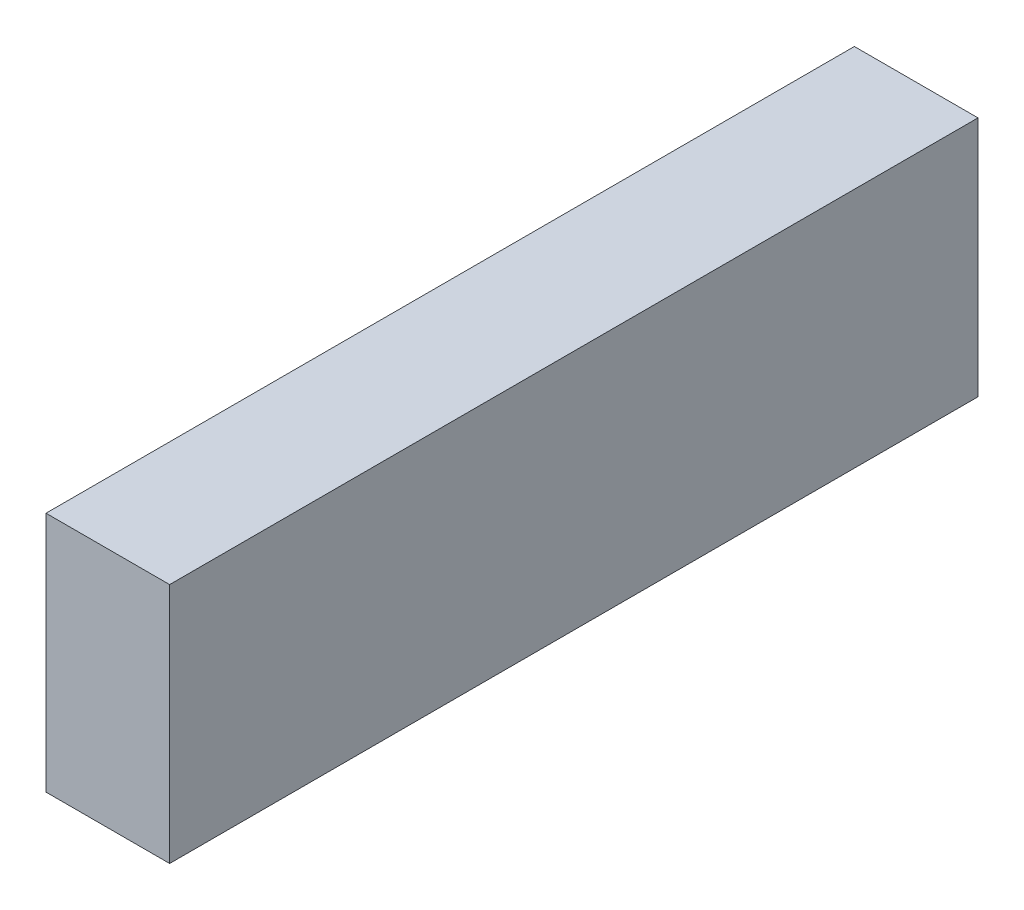
ISO-10303-21;
HEADER;
FILE_DESCRIPTION(('STEP AP214'),'2;1');
FILE_NAME('part.step','',(''),(''),'','','');
FILE_SCHEMA(('AUTOMOTIVE_DESIGN { 1 0 10303 214 1 1 1 1 }'));
ENDSEC;
DATA;
#1=APPLICATION_CONTEXT('core data for automotive mechanical design processes');
#2=APPLICATION_PROTOCOL_DEFINITION('international standard','automotive_design',2000,#1);
#3=PRODUCT_CONTEXT('',#1,'mechanical');
#4=PRODUCT('Part','Part','',(#3));
#5=PRODUCT_RELATED_PRODUCT_CATEGORY('part','',(#4));
#6=PRODUCT_DEFINITION_FORMATION('','',#4);
#7=PRODUCT_DEFINITION_CONTEXT('part definition',#1,'design');
#8=PRODUCT_DEFINITION('design','',#6,#7);
#9=PRODUCT_DEFINITION_SHAPE('','',#8);
#10=(LENGTH_UNIT() NAMED_UNIT(*) SI_UNIT(.MILLI.,.METRE.));
#11=(NAMED_UNIT(*) PLANE_ANGLE_UNIT() SI_UNIT($,.RADIAN.));
#12=(NAMED_UNIT(*) SI_UNIT($,.STERADIAN.) SOLID_ANGLE_UNIT());
#13=UNCERTAINTY_MEASURE_WITH_UNIT(LENGTH_MEASURE(1.E-05),#10,'distance_accuracy_value','');
#14=(GEOMETRIC_REPRESENTATION_CONTEXT(3) GLOBAL_UNCERTAINTY_ASSIGNED_CONTEXT((#13)) GLOBAL_UNIT_ASSIGNED_CONTEXT((#10,
#11,#12)) REPRESENTATION_CONTEXT('',''));
#15=CARTESIAN_POINT('',(0.,0.,0.));
#16=DIRECTION('',(0.,0.,1.));
#17=DIRECTION('',(1.,0.,0.));
#18=AXIS2_PLACEMENT_3D('',#15,#16,#17);
#19=CARTESIAN_POINT('',(0.,0.,8.5));
#20=DIRECTION('',(0.,0.,1.));
#21=DIRECTION('',(1.,0.,0.));
#22=AXIS2_PLACEMENT_3D('',#19,#20,#21);
#23=PLANE('',#22);
#24=DIRECTION('',(0.,1.,0.));
#25=VECTOR('',#24,1.);
#26=CARTESIAN_POINT('',(0.,0.,8.5));
#27=LINE('',#26,#25);
#28=CARTESIAN_POINT('',(0.,0.,8.5));
#29=VERTEX_POINT('',#28);
#30=CARTESIAN_POINT('',(0.,2.54,8.5));
#31=VERTEX_POINT('',#30);
#32=EDGE_CURVE('E112',#29,#31,#27,.T.);
#33=ORIENTED_EDGE('',*,*,#32,.F.);
#34=DIRECTION('',(1.,0.,0.));
#35=VECTOR('',#34,1.);
#36=CARTESIAN_POINT('',(0.,0.,8.5));
#37=LINE('',#36,#35);
#38=CARTESIAN_POINT('',(1.3,0.,8.5));
#39=VERTEX_POINT('',#38);
#40=EDGE_CURVE('E20',#29,#39,#37,.T.);
#41=ORIENTED_EDGE('',*,*,#40,.T.);
#42=DIRECTION('',(0.,1.,0.));
#43=VECTOR('',#42,1.);
#44=CARTESIAN_POINT('',(1.3,0.,8.5));
#45=LINE('',#44,#43);
#46=CARTESIAN_POINT('',(1.3,2.54,8.5));
#47=VERTEX_POINT('',#46);
#48=EDGE_CURVE('E93',#39,#47,#45,.T.);
#49=ORIENTED_EDGE('',*,*,#48,.T.);
#50=DIRECTION('',(1.,0.,0.));
#51=VECTOR('',#50,1.);
#52=CARTESIAN_POINT('',(0.,2.54,8.5));
#53=LINE('',#52,#51);
#54=EDGE_CURVE('E11',#31,#47,#53,.T.);
#55=ORIENTED_EDGE('',*,*,#54,.F.);
#56=EDGE_LOOP('',(#33,#41,#49,#55));
#57=FACE_BOUND('',#56,.T.);
#58=ADVANCED_FACE('F17',(#57),#23,.T.);
#59=CARTESIAN_POINT('',(0.,0.,0.));
#60=DIRECTION('',(0.,0.,1.));
#61=DIRECTION('',(1.,0.,0.));
#62=AXIS2_PLACEMENT_3D('',#59,#60,#61);
#63=PLANE('',#62);
#64=DIRECTION('',(1.,0.,0.));
#65=VECTOR('',#64,1.);
#66=CARTESIAN_POINT('',(0.,2.54,0.));
#67=LINE('',#66,#65);
#68=CARTESIAN_POINT('',(0.,2.54,0.));
#69=VERTEX_POINT('',#68);
#70=CARTESIAN_POINT('',(1.3,2.54,0.));
#71=VERTEX_POINT('',#70);
#72=EDGE_CURVE('E27',#69,#71,#67,.T.);
#73=ORIENTED_EDGE('',*,*,#72,.T.);
#74=DIRECTION('',(0.,1.,0.));
#75=VECTOR('',#74,1.);
#76=CARTESIAN_POINT('',(1.3,0.,0.));
#77=LINE('',#76,#75);
#78=CARTESIAN_POINT('',(1.3,0.,0.));
#79=VERTEX_POINT('',#78);
#80=EDGE_CURVE('E85',#79,#71,#77,.T.);
#81=ORIENTED_EDGE('',*,*,#80,.F.);
#82=DIRECTION('',(1.,0.,0.));
#83=VECTOR('',#82,1.);
#84=CARTESIAN_POINT('',(0.,0.,0.));
#85=LINE('',#84,#83);
#86=CARTESIAN_POINT('',(0.,0.,0.));
#87=VERTEX_POINT('',#86);
#88=EDGE_CURVE('E71',#87,#79,#85,.T.);
#89=ORIENTED_EDGE('',*,*,#88,.F.);
#90=DIRECTION('',(0.,1.,0.));
#91=VECTOR('',#90,1.);
#92=CARTESIAN_POINT('',(0.,0.,0.));
#93=LINE('',#92,#91);
#94=EDGE_CURVE('E96',#87,#69,#93,.T.);
#95=ORIENTED_EDGE('',*,*,#94,.T.);
#96=EDGE_LOOP('',(#73,#81,#89,#95));
#97=FACE_BOUND('',#96,.T.);
#98=ADVANCED_FACE('F83',(#97),#63,.F.);
#99=CARTESIAN_POINT('',(0.,2.54,0.));
#100=DIRECTION('',(0.,1.,0.));
#101=DIRECTION('',(1.,0.,0.));
#102=AXIS2_PLACEMENT_3D('',#99,#100,#101);
#103=PLANE('',#102);
#104=ORIENTED_EDGE('',*,*,#72,.F.);
#105=DIRECTION('',(0.,0.,1.));
#106=VECTOR('',#105,1.);
#107=CARTESIAN_POINT('',(0.,2.54,0.));
#108=LINE('',#107,#106);
#109=EDGE_CURVE('E113',#69,#31,#108,.T.);
#110=ORIENTED_EDGE('',*,*,#109,.T.);
#111=ORIENTED_EDGE('',*,*,#54,.T.);
#112=DIRECTION('',(0.,0.,1.));
#113=VECTOR('',#112,1.);
#114=CARTESIAN_POINT('',(1.3,2.54,0.));
#115=LINE('',#114,#113);
#116=EDGE_CURVE('E87',#71,#47,#115,.T.);
#117=ORIENTED_EDGE('',*,*,#116,.F.);
#118=EDGE_LOOP('',(#104,#110,#111,#117));
#119=FACE_BOUND('',#118,.T.);
#120=ADVANCED_FACE('F130',(#119),#103,.T.);
#121=CARTESIAN_POINT('',(0.,0.,0.));
#122=DIRECTION('',(0.,1.,0.));
#123=DIRECTION('',(1.,0.,0.));
#124=AXIS2_PLACEMENT_3D('',#121,#122,#123);
#125=PLANE('',#124);
#126=DIRECTION('',(0.,0.,1.));
#127=VECTOR('',#126,1.);
#128=CARTESIAN_POINT('',(1.3,0.,0.));
#129=LINE('',#128,#127);
#130=EDGE_CURVE('E74',#79,#39,#129,.T.);
#131=ORIENTED_EDGE('',*,*,#130,.T.);
#132=ORIENTED_EDGE('',*,*,#40,.F.);
#133=DIRECTION('',(0.,0.,1.));
#134=VECTOR('',#133,1.);
#135=CARTESIAN_POINT('',(0.,0.,0.));
#136=LINE('',#135,#134);
#137=EDGE_CURVE('E80',#87,#29,#136,.T.);
#138=ORIENTED_EDGE('',*,*,#137,.F.);
#139=ORIENTED_EDGE('',*,*,#88,.T.);
#140=EDGE_LOOP('',(#131,#132,#138,#139));
#141=FACE_BOUND('',#140,.T.);
#142=ADVANCED_FACE('F73',(#141),#125,.F.);
#143=CARTESIAN_POINT('',(1.3,0.,0.));
#144=DIRECTION('',(1.,0.,0.));
#145=DIRECTION('',(0.,1.,0.));
#146=AXIS2_PLACEMENT_3D('',#143,#144,#145);
#147=PLANE('',#146);
#148=ORIENTED_EDGE('',*,*,#130,.F.);
#149=ORIENTED_EDGE('',*,*,#80,.T.);
#150=ORIENTED_EDGE('',*,*,#116,.T.);
#151=ORIENTED_EDGE('',*,*,#48,.F.);
#152=EDGE_LOOP('',(#148,#149,#150,#151));
#153=FACE_BOUND('',#152,.T.);
#154=ADVANCED_FACE('F89',(#153),#147,.T.);
#155=CARTESIAN_POINT('',(0.,0.,0.));
#156=DIRECTION('',(1.,0.,0.));
#157=DIRECTION('',(0.,1.,0.));
#158=AXIS2_PLACEMENT_3D('',#155,#156,#157);
#159=PLANE('',#158);
#160=ORIENTED_EDGE('',*,*,#32,.T.);
#161=ORIENTED_EDGE('',*,*,#109,.F.);
#162=ORIENTED_EDGE('',*,*,#94,.F.);
#163=ORIENTED_EDGE('',*,*,#137,.T.);
#164=EDGE_LOOP('',(#160,#161,#162,#163));
#165=FACE_BOUND('',#164,.T.);
#166=ADVANCED_FACE('F114',(#165),#159,.F.);
#167=CLOSED_SHELL('',(#58,#98,#120,#142,#154,#166));
#168=MANIFOLD_SOLID_BREP('B1',#167);
#169=ADVANCED_BREP_SHAPE_REPRESENTATION('',(#18,#168),#14);
#170=SHAPE_DEFINITION_REPRESENTATION(#9,#169);
ENDSEC;
END-ISO-10303-21;
